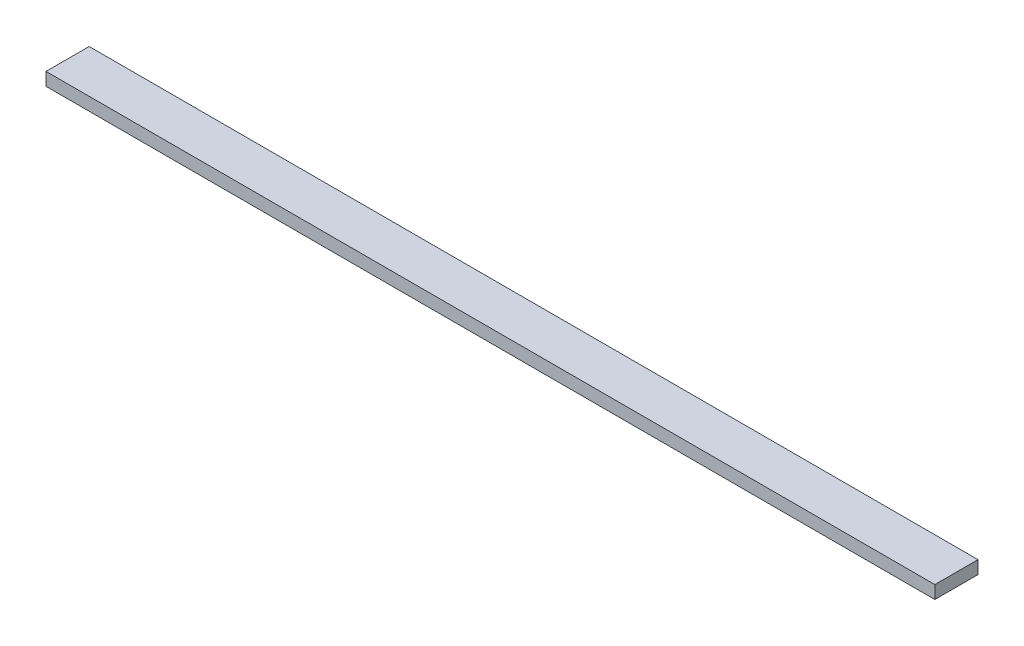
ISO-10303-21;
HEADER;
FILE_DESCRIPTION(('STEP AP214'),'2;1');
FILE_NAME('part.step','',(''),(''),'','','');
FILE_SCHEMA(('AUTOMOTIVE_DESIGN { 1 0 10303 214 1 1 1 1 }'));
ENDSEC;
DATA;
#1=APPLICATION_CONTEXT('core data for automotive mechanical design processes');
#2=APPLICATION_PROTOCOL_DEFINITION('international standard','automotive_design',2000,#1);
#3=PRODUCT_CONTEXT('',#1,'mechanical');
#4=PRODUCT('Part','Part','',(#3));
#5=PRODUCT_RELATED_PRODUCT_CATEGORY('part','',(#4));
#6=PRODUCT_DEFINITION_FORMATION('','',#4);
#7=PRODUCT_DEFINITION_CONTEXT('part definition',#1,'design');
#8=PRODUCT_DEFINITION('design','',#6,#7);
#9=PRODUCT_DEFINITION_SHAPE('','',#8);
#10=(LENGTH_UNIT() NAMED_UNIT(*) SI_UNIT(.MILLI.,.METRE.));
#11=(NAMED_UNIT(*) PLANE_ANGLE_UNIT() SI_UNIT($,.RADIAN.));
#12=(NAMED_UNIT(*) SI_UNIT($,.STERADIAN.) SOLID_ANGLE_UNIT());
#13=UNCERTAINTY_MEASURE_WITH_UNIT(LENGTH_MEASURE(1.E-05),#10,'distance_accuracy_value','');
#14=(GEOMETRIC_REPRESENTATION_CONTEXT(3) GLOBAL_UNCERTAINTY_ASSIGNED_CONTEXT((#13)) GLOBAL_UNIT_ASSIGNED_CONTEXT((#10,
#11,#12)) REPRESENTATION_CONTEXT('',''));
#15=CARTESIAN_POINT('',(0.,0.,0.));
#16=DIRECTION('',(0.,0.,1.));
#17=DIRECTION('',(1.,0.,0.));
#18=AXIS2_PLACEMENT_3D('',#15,#16,#17);
#19=CARTESIAN_POINT('',(103.,1.5,5.));
#20=DIRECTION('',(-1.,0.,0.));
#21=DIRECTION('',(0.,0.,1.));
#22=AXIS2_PLACEMENT_3D('',#19,#20,#21);
#23=PLANE('',#22);
#24=DIRECTION('',(0.,0.,-1.));
#25=VECTOR('',#24,1.);
#26=CARTESIAN_POINT('',(103.,-1.5,5.));
#27=LINE('',#26,#25);
#28=CARTESIAN_POINT('',(103.,-1.5,5.));
#29=VERTEX_POINT('',#28);
#30=CARTESIAN_POINT('',(103.,-1.5,-5.));
#31=VERTEX_POINT('',#30);
#32=EDGE_CURVE('E111',#29,#31,#27,.T.);
#33=ORIENTED_EDGE('',*,*,#32,.T.);
#34=DIRECTION('',(0.,-1.,0.));
#35=VECTOR('',#34,1.);
#36=CARTESIAN_POINT('',(103.,1.5,-5.));
#37=LINE('',#36,#35);
#38=CARTESIAN_POINT('',(103.,1.5,-5.));
#39=VERTEX_POINT('',#38);
#40=EDGE_CURVE('E11',#39,#31,#37,.T.);
#41=ORIENTED_EDGE('',*,*,#40,.F.);
#42=DIRECTION('',(0.,0.,-1.));
#43=VECTOR('',#42,1.);
#44=CARTESIAN_POINT('',(103.,1.5,5.));
#45=LINE('',#44,#43);
#46=CARTESIAN_POINT('',(103.,1.5,5.));
#47=VERTEX_POINT('',#46);
#48=EDGE_CURVE('E95',#47,#39,#45,.T.);
#49=ORIENTED_EDGE('',*,*,#48,.F.);
#50=DIRECTION('',(0.,-1.,0.));
#51=VECTOR('',#50,1.);
#52=CARTESIAN_POINT('',(103.,1.5,5.));
#53=LINE('',#52,#51);
#54=EDGE_CURVE('E107',#47,#29,#53,.T.);
#55=ORIENTED_EDGE('',*,*,#54,.T.);
#56=EDGE_LOOP('',(#33,#41,#49,#55));
#57=FACE_BOUND('',#56,.T.);
#58=ADVANCED_FACE('F43',(#57),#23,.F.);
#59=CARTESIAN_POINT('',(-103.,1.5,-5.));
#60=DIRECTION('',(0.,0.,1.));
#61=DIRECTION('',(1.,0.,0.));
#62=AXIS2_PLACEMENT_3D('',#59,#60,#61);
#63=PLANE('',#62);
#64=DIRECTION('',(-1.,0.,0.));
#65=VECTOR('',#64,1.);
#66=CARTESIAN_POINT('',(-103.,-1.5,-5.));
#67=LINE('',#66,#65);
#68=CARTESIAN_POINT('',(-103.,-1.5,-5.));
#69=VERTEX_POINT('',#68);
#70=EDGE_CURVE('E100',#31,#69,#67,.T.);
#71=ORIENTED_EDGE('',*,*,#70,.T.);
#72=DIRECTION('',(0.,-1.,0.));
#73=VECTOR('',#72,1.);
#74=CARTESIAN_POINT('',(-103.,1.5,-5.));
#75=LINE('',#74,#73);
#76=CARTESIAN_POINT('',(-103.,1.5,-5.));
#77=VERTEX_POINT('',#76);
#78=EDGE_CURVE('E52',#77,#69,#75,.T.);
#79=ORIENTED_EDGE('',*,*,#78,.F.);
#80=DIRECTION('',(-1.,0.,0.));
#81=VECTOR('',#80,1.);
#82=CARTESIAN_POINT('',(-103.,1.5,-5.));
#83=LINE('',#82,#81);
#84=EDGE_CURVE('E90',#39,#77,#83,.T.);
#85=ORIENTED_EDGE('',*,*,#84,.F.);
#86=ORIENTED_EDGE('',*,*,#40,.T.);
#87=EDGE_LOOP('',(#71,#79,#85,#86));
#88=FACE_BOUND('',#87,.T.);
#89=ADVANCED_FACE('F99',(#88),#63,.F.);
#90=CARTESIAN_POINT('',(-103.,1.5,5.));
#91=DIRECTION('',(1.,0.,0.));
#92=DIRECTION('',(0.,0.,-1.));
#93=AXIS2_PLACEMENT_3D('',#90,#91,#92);
#94=PLANE('',#93);
#95=DIRECTION('',(0.,0.,1.));
#96=VECTOR('',#95,1.);
#97=CARTESIAN_POINT('',(-103.,-1.5,5.));
#98=LINE('',#97,#96);
#99=CARTESIAN_POINT('',(-103.,-1.5,5.));
#100=VERTEX_POINT('',#99);
#101=EDGE_CURVE('E77',#69,#100,#98,.T.);
#102=ORIENTED_EDGE('',*,*,#101,.T.);
#103=DIRECTION('',(0.,-1.,0.));
#104=VECTOR('',#103,1.);
#105=CARTESIAN_POINT('',(-103.,1.5,5.));
#106=LINE('',#105,#104);
#107=CARTESIAN_POINT('',(-103.,1.5,5.));
#108=VERTEX_POINT('',#107);
#109=EDGE_CURVE('E102',#108,#100,#106,.T.);
#110=ORIENTED_EDGE('',*,*,#109,.F.);
#111=DIRECTION('',(0.,0.,1.));
#112=VECTOR('',#111,1.);
#113=CARTESIAN_POINT('',(-103.,1.5,5.));
#114=LINE('',#113,#112);
#115=EDGE_CURVE('E93',#77,#108,#114,.T.);
#116=ORIENTED_EDGE('',*,*,#115,.F.);
#117=ORIENTED_EDGE('',*,*,#78,.T.);
#118=EDGE_LOOP('',(#102,#110,#116,#117));
#119=FACE_BOUND('',#118,.T.);
#120=ADVANCED_FACE('F103',(#119),#94,.F.);
#121=CARTESIAN_POINT('',(-103.,1.5,5.));
#122=DIRECTION('',(0.,0.,-1.));
#123=DIRECTION('',(-1.,0.,0.));
#124=AXIS2_PLACEMENT_3D('',#121,#122,#123);
#125=PLANE('',#124);
#126=DIRECTION('',(1.,0.,0.));
#127=VECTOR('',#126,1.);
#128=CARTESIAN_POINT('',(-103.,-1.5,5.));
#129=LINE('',#128,#127);
#130=EDGE_CURVE('E83',#100,#29,#129,.T.);
#131=ORIENTED_EDGE('',*,*,#130,.T.);
#132=ORIENTED_EDGE('',*,*,#54,.F.);
#133=DIRECTION('',(1.,0.,0.));
#134=VECTOR('',#133,1.);
#135=CARTESIAN_POINT('',(-103.,1.5,5.));
#136=LINE('',#135,#134);
#137=EDGE_CURVE('E60',#108,#47,#136,.T.);
#138=ORIENTED_EDGE('',*,*,#137,.F.);
#139=ORIENTED_EDGE('',*,*,#109,.T.);
#140=EDGE_LOOP('',(#131,#132,#138,#139));
#141=FACE_BOUND('',#140,.T.);
#142=ADVANCED_FACE('F124',(#141),#125,.F.);
#143=CARTESIAN_POINT('',(0.,1.5,0.));
#144=DIRECTION('',(0.,-1.,0.));
#145=DIRECTION('',(0.,0.,-1.));
#146=AXIS2_PLACEMENT_3D('',#143,#144,#145);
#147=PLANE('',#146);
#148=ORIENTED_EDGE('',*,*,#48,.T.);
#149=ORIENTED_EDGE('',*,*,#84,.T.);
#150=ORIENTED_EDGE('',*,*,#115,.T.);
#151=ORIENTED_EDGE('',*,*,#137,.T.);
#152=EDGE_LOOP('',(#148,#149,#150,#151));
#153=FACE_BOUND('',#152,.T.);
#154=ADVANCED_FACE('F91',(#153),#147,.F.);
#155=CARTESIAN_POINT('',(0.,-1.5,0.));
#156=DIRECTION('',(0.,-1.,0.));
#157=DIRECTION('',(0.,0.,-1.));
#158=AXIS2_PLACEMENT_3D('',#155,#156,#157);
#159=PLANE('',#158);
#160=ORIENTED_EDGE('',*,*,#32,.F.);
#161=ORIENTED_EDGE('',*,*,#130,.F.);
#162=ORIENTED_EDGE('',*,*,#101,.F.);
#163=ORIENTED_EDGE('',*,*,#70,.F.);
#164=EDGE_LOOP('',(#160,#161,#162,#163));
#165=FACE_BOUND('',#164,.T.);
#166=ADVANCED_FACE('F127',(#165),#159,.T.);
#167=CLOSED_SHELL('',(#58,#89,#120,#142,#154,#166));
#168=MANIFOLD_SOLID_BREP('B2',#167);
#169=ADVANCED_BREP_SHAPE_REPRESENTATION('',(#18,#168),#14);
#170=SHAPE_DEFINITION_REPRESENTATION(#9,#169);
ENDSEC;
END-ISO-10303-21;
